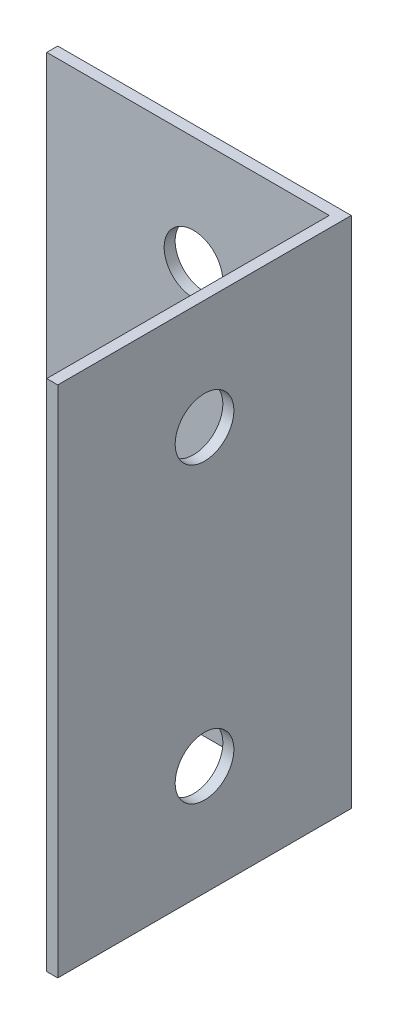
ISO-10303-21;
HEADER;
FILE_DESCRIPTION(('STEP AP214'),'2;1');
FILE_NAME('part.step','',(''),(''),'','','');
FILE_SCHEMA(('AUTOMOTIVE_DESIGN { 1 0 10303 214 1 1 1 1 }'));
ENDSEC;
DATA;
#1=APPLICATION_CONTEXT('core data for automotive mechanical design processes');
#2=APPLICATION_PROTOCOL_DEFINITION('international standard','automotive_design',2000,#1);
#3=PRODUCT_CONTEXT('',#1,'mechanical');
#4=PRODUCT('Part','Part','',(#3));
#5=PRODUCT_RELATED_PRODUCT_CATEGORY('part','',(#4));
#6=PRODUCT_DEFINITION_FORMATION('','',#4);
#7=PRODUCT_DEFINITION_CONTEXT('part definition',#1,'design');
#8=PRODUCT_DEFINITION('design','',#6,#7);
#9=PRODUCT_DEFINITION_SHAPE('','',#8);
#10=(LENGTH_UNIT() NAMED_UNIT(*) SI_UNIT(.MILLI.,.METRE.));
#11=(NAMED_UNIT(*) PLANE_ANGLE_UNIT() SI_UNIT($,.RADIAN.));
#12=(NAMED_UNIT(*) SI_UNIT($,.STERADIAN.) SOLID_ANGLE_UNIT());
#13=UNCERTAINTY_MEASURE_WITH_UNIT(LENGTH_MEASURE(1.E-05),#10,'distance_accuracy_value','');
#14=(GEOMETRIC_REPRESENTATION_CONTEXT(3) GLOBAL_UNCERTAINTY_ASSIGNED_CONTEXT((#13)) GLOBAL_UNIT_ASSIGNED_CONTEXT((#10,
#11,#12)) REPRESENTATION_CONTEXT('',''));
#15=CARTESIAN_POINT('',(0.,0.,0.));
#16=DIRECTION('',(0.,0.,1.));
#17=DIRECTION('',(1.,0.,0.));
#18=AXIS2_PLACEMENT_3D('',#15,#16,#17);
#19=CARTESIAN_POINT('',(-20.,-35.,40.));
#20=DIRECTION('',(1.,0.,0.));
#21=DIRECTION('',(0.,0.,-1.));
#22=AXIS2_PLACEMENT_3D('',#19,#20,#21);
#23=PLANE('',#22);
#24=DIRECTION('',(0.,0.,-1.));
#25=VECTOR('',#24,1.);
#26=CARTESIAN_POINT('',(-20.,-35.,40.));
#27=LINE('',#26,#25);
#28=CARTESIAN_POINT('',(-20.,-35.,1.5));
#29=VERTEX_POINT('',#28);
#30=CARTESIAN_POINT('',(-20.,-35.,0.));
#31=VERTEX_POINT('',#30);
#32=EDGE_CURVE('E47',#29,#31,#27,.T.);
#33=ORIENTED_EDGE('',*,*,#32,.F.);
#34=DIRECTION('',(0.,1.,0.));
#35=VECTOR('',#34,1.);
#36=CARTESIAN_POINT('',(-20.,-45.,1.5));
#37=LINE('',#36,#35);
#38=CARTESIAN_POINT('',(-20.,35.,1.5));
#39=VERTEX_POINT('',#38);
#40=EDGE_CURVE('E89',#29,#39,#37,.T.);
#41=ORIENTED_EDGE('',*,*,#40,.T.);
#42=DIRECTION('',(0.,0.,-1.));
#43=VECTOR('',#42,1.);
#44=CARTESIAN_POINT('',(-20.,35.,40.));
#45=LINE('',#44,#43);
#46=CARTESIAN_POINT('',(-20.,35.,0.));
#47=VERTEX_POINT('',#46);
#48=EDGE_CURVE('E82',#39,#47,#45,.T.);
#49=ORIENTED_EDGE('',*,*,#48,.T.);
#50=DIRECTION('',(0.,-1.,0.));
#51=VECTOR('',#50,1.);
#52=CARTESIAN_POINT('',(-20.,-35.,0.));
#53=LINE('',#52,#51);
#54=EDGE_CURVE('E86',#47,#31,#53,.T.);
#55=ORIENTED_EDGE('',*,*,#54,.T.);
#56=EDGE_LOOP('',(#33,#41,#49,#55));
#57=FACE_BOUND('',#56,.T.);
#58=ADVANCED_FACE('F39',(#57),#23,.F.);
#59=CARTESIAN_POINT('',(20.,-35.,40.));
#60=DIRECTION('',(0.,1.,0.));
#61=DIRECTION('',(-1.,0.,0.));
#62=AXIS2_PLACEMENT_3D('',#59,#60,#61);
#63=PLANE('',#62);
#64=DIRECTION('',(0.,0.,-1.));
#65=VECTOR('',#64,1.);
#66=CARTESIAN_POINT('',(18.5,-35.,40.));
#67=LINE('',#66,#65);
#68=CARTESIAN_POINT('',(18.5,-35.,40.));
#69=VERTEX_POINT('',#68);
#70=CARTESIAN_POINT('',(18.5,-35.,1.5));
#71=VERTEX_POINT('',#70);
#72=EDGE_CURVE('E53',#69,#71,#67,.T.);
#73=ORIENTED_EDGE('',*,*,#72,.T.);
#74=DIRECTION('',(-1.,0.,0.));
#75=VECTOR('',#74,1.);
#76=CARTESIAN_POINT('',(20.,-35.,1.5));
#77=LINE('',#76,#75);
#78=EDGE_CURVE('E111',#71,#29,#77,.T.);
#79=ORIENTED_EDGE('',*,*,#78,.T.);
#80=ORIENTED_EDGE('',*,*,#32,.T.);
#81=DIRECTION('',(1.,0.,0.));
#82=VECTOR('',#81,1.);
#83=CARTESIAN_POINT('',(20.,-35.,0.));
#84=LINE('',#83,#82);
#85=CARTESIAN_POINT('',(20.,-35.,0.));
#86=VERTEX_POINT('',#85);
#87=EDGE_CURVE('E109',#31,#86,#84,.T.);
#88=ORIENTED_EDGE('',*,*,#87,.T.);
#89=DIRECTION('',(0.,0.,-1.));
#90=VECTOR('',#89,1.);
#91=CARTESIAN_POINT('',(20.,-35.,40.));
#92=LINE('',#91,#90);
#93=CARTESIAN_POINT('',(20.,-35.,40.));
#94=VERTEX_POINT('',#93);
#95=EDGE_CURVE('E125',#94,#86,#92,.T.);
#96=ORIENTED_EDGE('',*,*,#95,.F.);
#97=DIRECTION('',(1.,0.,0.));
#98=VECTOR('',#97,1.);
#99=CARTESIAN_POINT('',(20.,-35.,40.));
#100=LINE('',#99,#98);
#101=EDGE_CURVE('E104',#69,#94,#100,.T.);
#102=ORIENTED_EDGE('',*,*,#101,.F.);
#103=EDGE_LOOP('',(#73,#79,#80,#88,#96,#102));
#104=FACE_BOUND('',#103,.T.);
#105=ADVANCED_FACE('F130',(#104),#63,.F.);
#106=CARTESIAN_POINT('',(20.,-35.,40.));
#107=DIRECTION('',(-1.,0.,0.));
#108=DIRECTION('',(0.,0.,1.));
#109=AXIS2_PLACEMENT_3D('',#106,#107,#108);
#110=PLANE('',#109);
#111=CARTESIAN_POINT('',(20.,20.,20.));
#112=DIRECTION('',(-1.,0.,0.));
#113=DIRECTION('',(0.,0.,1.));
#114=AXIS2_PLACEMENT_3D('',#111,#112,#113);
#115=CIRCLE('',#114,4.);
#116=CARTESIAN_POINT('',(20.,20.,24.));
#117=VERTEX_POINT('',#116);
#118=EDGE_CURVE('E150',#117,#117,#115,.T.);
#119=ORIENTED_EDGE('',*,*,#118,.T.);
#120=EDGE_LOOP('',(#119));
#121=FACE_BOUND('',#120,.T.);
#122=CARTESIAN_POINT('',(20.,-20.,20.));
#123=DIRECTION('',(-1.,0.,0.));
#124=DIRECTION('',(0.,0.,1.));
#125=AXIS2_PLACEMENT_3D('',#122,#123,#124);
#126=CIRCLE('',#125,4.);
#127=CARTESIAN_POINT('',(20.,-20.,24.));
#128=VERTEX_POINT('',#127);
#129=EDGE_CURVE('E170',#128,#128,#126,.T.);
#130=ORIENTED_EDGE('',*,*,#129,.T.);
#131=EDGE_LOOP('',(#130));
#132=FACE_BOUND('',#131,.T.);
#133=DIRECTION('',(0.,1.,0.));
#134=VECTOR('',#133,1.);
#135=CARTESIAN_POINT('',(20.,-35.,0.));
#136=LINE('',#135,#134);
#137=CARTESIAN_POINT('',(20.,35.,0.));
#138=VERTEX_POINT('',#137);
#139=EDGE_CURVE('E105',#86,#138,#136,.T.);
#140=ORIENTED_EDGE('',*,*,#139,.T.);
#141=DIRECTION('',(0.,0.,-1.));
#142=VECTOR('',#141,1.);
#143=CARTESIAN_POINT('',(20.,35.,40.));
#144=LINE('',#143,#142);
#145=CARTESIAN_POINT('',(20.,35.,40.));
#146=VERTEX_POINT('',#145);
#147=EDGE_CURVE('E93',#146,#138,#144,.T.);
#148=ORIENTED_EDGE('',*,*,#147,.F.);
#149=DIRECTION('',(0.,1.,0.));
#150=VECTOR('',#149,1.);
#151=CARTESIAN_POINT('',(20.,-35.,40.));
#152=LINE('',#151,#150);
#153=EDGE_CURVE('E62',#94,#146,#152,.T.);
#154=ORIENTED_EDGE('',*,*,#153,.F.);
#155=ORIENTED_EDGE('',*,*,#95,.T.);
#156=EDGE_LOOP('',(#140,#148,#154,#155));
#157=FACE_BOUND('',#156,.T.);
#158=ADVANCED_FACE('F208',(#121,#132,#157),#110,.F.);
#159=CARTESIAN_POINT('',(20.,35.,40.));
#160=DIRECTION('',(0.,-1.,0.));
#161=DIRECTION('',(0.,0.,-1.));
#162=AXIS2_PLACEMENT_3D('',#159,#160,#161);
#163=PLANE('',#162);
#164=ORIENTED_EDGE('',*,*,#48,.F.);
#165=DIRECTION('',(-1.,0.,0.));
#166=VECTOR('',#165,1.);
#167=CARTESIAN_POINT('',(-20.,35.,1.5));
#168=LINE('',#167,#166);
#169=CARTESIAN_POINT('',(18.5,35.,1.5));
#170=VERTEX_POINT('',#169);
#171=EDGE_CURVE('E148',#170,#39,#168,.T.);
#172=ORIENTED_EDGE('',*,*,#171,.F.);
#173=DIRECTION('',(0.,0.,-1.));
#174=VECTOR('',#173,1.);
#175=CARTESIAN_POINT('',(18.5,35.,40.));
#176=LINE('',#175,#174);
#177=CARTESIAN_POINT('',(18.5,35.,40.));
#178=VERTEX_POINT('',#177);
#179=EDGE_CURVE('E146',#178,#170,#176,.T.);
#180=ORIENTED_EDGE('',*,*,#179,.F.);
#181=DIRECTION('',(-1.,0.,0.));
#182=VECTOR('',#181,1.);
#183=CARTESIAN_POINT('',(20.,35.,40.));
#184=LINE('',#183,#182);
#185=EDGE_CURVE('E94',#146,#178,#184,.T.);
#186=ORIENTED_EDGE('',*,*,#185,.F.);
#187=ORIENTED_EDGE('',*,*,#147,.T.);
#188=DIRECTION('',(-1.,0.,0.));
#189=VECTOR('',#188,1.);
#190=CARTESIAN_POINT('',(20.,35.,0.));
#191=LINE('',#190,#189);
#192=EDGE_CURVE('E98',#138,#47,#191,.T.);
#193=ORIENTED_EDGE('',*,*,#192,.T.);
#194=EDGE_LOOP('',(#164,#172,#180,#186,#187,#193));
#195=FACE_BOUND('',#194,.T.);
#196=ADVANCED_FACE('F99',(#195),#163,.F.);
#197=CARTESIAN_POINT('',(0.,0.,40.));
#198=DIRECTION('',(0.,0.,1.));
#199=DIRECTION('',(1.,0.,0.));
#200=AXIS2_PLACEMENT_3D('',#197,#198,#199);
#201=PLANE('',#200);
#202=DIRECTION('',(0.,1.,0.));
#203=VECTOR('',#202,1.);
#204=CARTESIAN_POINT('',(18.5,0.,40.));
#205=LINE('',#204,#203);
#206=EDGE_CURVE('E11',#69,#178,#205,.T.);
#207=ORIENTED_EDGE('',*,*,#206,.F.);
#208=ORIENTED_EDGE('',*,*,#101,.T.);
#209=ORIENTED_EDGE('',*,*,#153,.T.);
#210=ORIENTED_EDGE('',*,*,#185,.T.);
#211=EDGE_LOOP('',(#207,#208,#209,#210));
#212=FACE_BOUND('',#211,.T.);
#213=ADVANCED_FACE('F152',(#212),#201,.T.);
#214=CARTESIAN_POINT('',(0.,0.,0.));
#215=DIRECTION('',(0.,0.,1.));
#216=DIRECTION('',(1.,0.,0.));
#217=AXIS2_PLACEMENT_3D('',#214,#215,#216);
#218=PLANE('',#217);
#219=CARTESIAN_POINT('',(0.,20.,0.));
#220=DIRECTION('',(0.,0.,1.));
#221=DIRECTION('',(1.,0.,0.));
#222=AXIS2_PLACEMENT_3D('',#219,#220,#221);
#223=CIRCLE('',#222,4.);
#224=CARTESIAN_POINT('',(4.,20.,0.));
#225=VERTEX_POINT('',#224);
#226=EDGE_CURVE('E179',#225,#225,#223,.T.);
#227=ORIENTED_EDGE('',*,*,#226,.T.);
#228=EDGE_LOOP('',(#227));
#229=FACE_BOUND('',#228,.T.);
#230=CARTESIAN_POINT('',(0.,-20.,0.));
#231=DIRECTION('',(0.,0.,1.));
#232=DIRECTION('',(1.,0.,0.));
#233=AXIS2_PLACEMENT_3D('',#230,#231,#232);
#234=CIRCLE('',#233,4.);
#235=CARTESIAN_POINT('',(4.,-20.,0.));
#236=VERTEX_POINT('',#235);
#237=EDGE_CURVE('E186',#236,#236,#234,.T.);
#238=ORIENTED_EDGE('',*,*,#237,.T.);
#239=EDGE_LOOP('',(#238));
#240=FACE_BOUND('',#239,.T.);
#241=ORIENTED_EDGE('',*,*,#54,.F.);
#242=ORIENTED_EDGE('',*,*,#192,.F.);
#243=ORIENTED_EDGE('',*,*,#139,.F.);
#244=ORIENTED_EDGE('',*,*,#87,.F.);
#245=EDGE_LOOP('',(#241,#242,#243,#244));
#246=FACE_BOUND('',#245,.T.);
#247=ADVANCED_FACE('F108',(#229,#240,#246),#218,.F.);
#248=CARTESIAN_POINT('',(-20.,-45.,1.5));
#249=DIRECTION('',(0.,0.,-1.));
#250=DIRECTION('',(-1.,0.,0.));
#251=AXIS2_PLACEMENT_3D('',#248,#249,#250);
#252=PLANE('',#251);
#253=CARTESIAN_POINT('',(0.,20.,1.5));
#254=DIRECTION('',(0.,0.,1.));
#255=DIRECTION('',(1.,0.,0.));
#256=AXIS2_PLACEMENT_3D('',#253,#254,#255);
#257=CIRCLE('',#256,4.);
#258=CARTESIAN_POINT('',(4.,20.,1.5));
#259=VERTEX_POINT('',#258);
#260=EDGE_CURVE('E190',#259,#259,#257,.T.);
#261=ORIENTED_EDGE('',*,*,#260,.F.);
#262=EDGE_LOOP('',(#261));
#263=FACE_BOUND('',#262,.T.);
#264=CARTESIAN_POINT('',(0.,-20.,1.5));
#265=DIRECTION('',(0.,0.,1.));
#266=DIRECTION('',(-1.,0.,0.));
#267=AXIS2_PLACEMENT_3D('',#264,#265,#266);
#268=CIRCLE('',#267,4.);
#269=CARTESIAN_POINT('',(4.,-20.,1.5));
#270=VERTEX_POINT('',#269);
#271=EDGE_CURVE('E191',#270,#270,#268,.T.);
#272=ORIENTED_EDGE('',*,*,#271,.F.);
#273=EDGE_LOOP('',(#272));
#274=FACE_BOUND('',#273,.T.);
#275=DIRECTION('',(0.,1.,0.));
#276=VECTOR('',#275,1.);
#277=CARTESIAN_POINT('',(18.5,-45.,1.5));
#278=LINE('',#277,#276);
#279=EDGE_CURVE('E160',#71,#170,#278,.T.);
#280=ORIENTED_EDGE('',*,*,#279,.T.);
#281=ORIENTED_EDGE('',*,*,#171,.T.);
#282=ORIENTED_EDGE('',*,*,#40,.F.);
#283=ORIENTED_EDGE('',*,*,#78,.F.);
#284=EDGE_LOOP('',(#280,#281,#282,#283));
#285=FACE_BOUND('',#284,.T.);
#286=ADVANCED_FACE('F202',(#263,#274,#285),#252,.F.);
#287=CARTESIAN_POINT('',(18.5,-45.,40.));
#288=DIRECTION('',(1.,0.,0.));
#289=DIRECTION('',(0.,1.,0.));
#290=AXIS2_PLACEMENT_3D('',#287,#288,#289);
#291=PLANE('',#290);
#292=CARTESIAN_POINT('',(18.5,20.,20.));
#293=DIRECTION('',(-1.,0.,0.));
#294=DIRECTION('',(0.,-1.,0.));
#295=AXIS2_PLACEMENT_3D('',#292,#293,#294);
#296=CIRCLE('',#295,4.);
#297=CARTESIAN_POINT('',(18.5,16.,20.));
#298=VERTEX_POINT('',#297);
#299=EDGE_CURVE('E174',#298,#298,#296,.T.);
#300=ORIENTED_EDGE('',*,*,#299,.F.);
#301=EDGE_LOOP('',(#300));
#302=FACE_BOUND('',#301,.T.);
#303=CARTESIAN_POINT('',(18.5,-20.,20.));
#304=DIRECTION('',(-1.,0.,0.));
#305=DIRECTION('',(0.,1.,0.));
#306=AXIS2_PLACEMENT_3D('',#303,#304,#305);
#307=CIRCLE('',#306,4.);
#308=CARTESIAN_POINT('',(18.5,-16.,20.));
#309=VERTEX_POINT('',#308);
#310=EDGE_CURVE('E175',#309,#309,#307,.T.);
#311=ORIENTED_EDGE('',*,*,#310,.F.);
#312=EDGE_LOOP('',(#311));
#313=FACE_BOUND('',#312,.T.);
#314=ORIENTED_EDGE('',*,*,#206,.T.);
#315=ORIENTED_EDGE('',*,*,#179,.T.);
#316=ORIENTED_EDGE('',*,*,#279,.F.);
#317=ORIENTED_EDGE('',*,*,#72,.F.);
#318=EDGE_LOOP('',(#314,#315,#316,#317));
#319=FACE_BOUND('',#318,.T.);
#320=ADVANCED_FACE('F145',(#302,#313,#319),#291,.F.);
#321=CARTESIAN_POINT('',(98.5000000000001,-20.,20.));
#322=DIRECTION('',(-1.,0.,0.));
#323=DIRECTION('',(0.,-1.,0.));
#324=AXIS2_PLACEMENT_3D('',#321,#322,#323);
#325=CYLINDRICAL_SURFACE('',#324,4.);
#326=ORIENTED_EDGE('',*,*,#310,.T.);
#327=EDGE_LOOP('',(#326));
#328=FACE_BOUND('',#327,.T.);
#329=ORIENTED_EDGE('',*,*,#129,.F.);
#330=EDGE_LOOP('',(#329));
#331=FACE_BOUND('',#330,.T.);
#332=ADVANCED_FACE('F254',(#328,#331),#325,.F.);
#333=CARTESIAN_POINT('',(98.5,20.,20.));
#334=DIRECTION('',(-1.,0.,0.));
#335=DIRECTION('',(0.,-1.,0.));
#336=AXIS2_PLACEMENT_3D('',#333,#334,#335);
#337=CYLINDRICAL_SURFACE('',#336,4.);
#338=ORIENTED_EDGE('',*,*,#299,.T.);
#339=EDGE_LOOP('',(#338));
#340=FACE_BOUND('',#339,.T.);
#341=ORIENTED_EDGE('',*,*,#118,.F.);
#342=EDGE_LOOP('',(#341));
#343=FACE_BOUND('',#342,.T.);
#344=ADVANCED_FACE('F265',(#340,#343),#337,.F.);
#345=CARTESIAN_POINT('',(0.,-20.,-38.5));
#346=DIRECTION('',(0.,0.,1.));
#347=DIRECTION('',(1.,0.,0.));
#348=AXIS2_PLACEMENT_3D('',#345,#346,#347);
#349=CYLINDRICAL_SURFACE('',#348,4.);
#350=CARTESIAN_POINT('',(4.,-20.,1.5));
#351=CARTESIAN_POINT('',(4.,-20.,1.484375));
#352=CARTESIAN_POINT('',(4.,-20.,1.46875));
#353=CARTESIAN_POINT('',(4.,-20.,1.4375));
#354=CARTESIAN_POINT('',(4.,-20.,1.421875));
#355=CARTESIAN_POINT('',(4.,-20.,1.390625));
#356=CARTESIAN_POINT('',(4.,-20.,1.375));
#357=CARTESIAN_POINT('',(4.,-20.,1.34375));
#358=CARTESIAN_POINT('',(4.,-20.,1.328125));
#359=CARTESIAN_POINT('',(4.,-20.,1.296875));
#360=CARTESIAN_POINT('',(4.,-20.,1.28125));
#361=CARTESIAN_POINT('',(4.,-20.,1.25));
#362=CARTESIAN_POINT('',(4.,-20.,1.234375));
#363=CARTESIAN_POINT('',(4.,-20.,1.203125));
#364=CARTESIAN_POINT('',(4.,-20.,1.1875));
#365=CARTESIAN_POINT('',(4.,-20.,1.15625));
#366=CARTESIAN_POINT('',(4.,-20.,1.140625));
#367=CARTESIAN_POINT('',(4.,-20.,1.109375));
#368=CARTESIAN_POINT('',(4.,-20.,1.09375));
#369=CARTESIAN_POINT('',(4.,-20.,1.0625));
#370=CARTESIAN_POINT('',(4.,-20.,1.046875));
#371=CARTESIAN_POINT('',(4.,-20.,1.015625));
#372=CARTESIAN_POINT('',(4.,-20.,1.));
#373=CARTESIAN_POINT('',(4.,-20.,0.968750000000002));
#374=CARTESIAN_POINT('',(4.,-20.,0.953125000000001));
#375=CARTESIAN_POINT('',(4.,-20.,0.921875));
#376=CARTESIAN_POINT('',(4.,-20.,0.90625));
#377=CARTESIAN_POINT('',(4.,-20.,0.875000000000001));
#378=CARTESIAN_POINT('',(4.,-20.,0.859375000000002));
#379=CARTESIAN_POINT('',(4.,-20.,0.828125000000004));
#380=CARTESIAN_POINT('',(4.,-20.,0.812500000000003));
#381=CARTESIAN_POINT('',(4.,-20.,0.781250000000002));
#382=CARTESIAN_POINT('',(4.,-20.,0.765625000000001));
#383=CARTESIAN_POINT('',(4.,-20.,0.734375));
#384=CARTESIAN_POINT('',(4.,-20.,0.718749999999999));
#385=CARTESIAN_POINT('',(4.,-20.,0.687499999999998));
#386=CARTESIAN_POINT('',(4.,-20.,0.671874999999998));
#387=CARTESIAN_POINT('',(4.,-20.,0.640624999999999));
#388=CARTESIAN_POINT('',(4.,-20.,0.625000000000001));
#389=CARTESIAN_POINT('',(4.,-20.,0.593750000000002));
#390=CARTESIAN_POINT('',(4.,-20.,0.578125000000001));
#391=CARTESIAN_POINT('',(4.,-20.,0.546875));
#392=CARTESIAN_POINT('',(4.,-20.,0.531249999999999));
#393=CARTESIAN_POINT('',(4.,-20.,0.5));
#394=CARTESIAN_POINT('',(4.,-20.,0.484375000000002));
#395=CARTESIAN_POINT('',(4.,-20.,0.453125000000003));
#396=CARTESIAN_POINT('',(4.,-20.,0.437500000000003));
#397=CARTESIAN_POINT('',(4.,-20.,0.406250000000001));
#398=CARTESIAN_POINT('',(4.,-20.,0.390625000000001));
#399=CARTESIAN_POINT('',(4.,-20.,0.359375));
#400=CARTESIAN_POINT('',(4.,-20.,0.343749999999999));
#401=CARTESIAN_POINT('',(4.,-20.,0.312499999999998));
#402=CARTESIAN_POINT('',(4.,-20.,0.296874999999997));
#403=CARTESIAN_POINT('',(4.,-20.,0.265624999999999));
#404=CARTESIAN_POINT('',(4.,-20.,0.25));
#405=CARTESIAN_POINT('',(4.,-20.,0.218750000000001));
#406=CARTESIAN_POINT('',(4.,-20.,0.203125000000001));
#407=CARTESIAN_POINT('',(4.,-20.,0.171875));
#408=CARTESIAN_POINT('',(4.,-20.,0.156249999999999));
#409=CARTESIAN_POINT('',(4.,-20.,0.125));
#410=CARTESIAN_POINT('',(4.,-20.,0.109375000000002));
#411=CARTESIAN_POINT('',(4.,-20.,0.078125000000003));
#412=CARTESIAN_POINT('',(4.,-20.,0.0625000000000024));
#413=CARTESIAN_POINT('',(4.,-20.,0.0312500000000012));
#414=CARTESIAN_POINT('',(4.,-20.,0.0156250000000006));
#415=CARTESIAN_POINT('',(4.,-20.,0.));
#416=B_SPLINE_CURVE_WITH_KNOTS('',3,(#350,#351,#352,#353,#354,#355,#356,#357,#358,#359,#360,
#361,#362,#363,#364,#365,#366,#367,#368,#369,#370,#371,#372,#373,#374,#375,#376,#377,#378,#379,
#380,#381,#382,#383,#384,#385,#386,#387,#388,#389,#390,#391,#392,#393,#394,#395,#396,#397,#398,
#399,#400,#401,#402,#403,#404,#405,#406,#407,#408,#409,#410,#411,#412,#413,#414,#415),
.UNSPECIFIED.,.F.,.F.,(4,2,2,2,2,2,2,2,2,2,2,2,2,2,2,2,2,2,2,2,2,2,2,2,2,2,2,2,2,2,2,2,4),(0.,
0.0468750000000018,0.0937500000000036,0.140624999999998,0.1875,0.234375000000002,
0.281249999999997,0.328124999999999,0.375,0.421875000000002,0.468750000000004,0.515624999999999,
0.5625,0.609375000000002,0.656249999999997,0.703124999999999,0.750000000000001,
0.796875000000002,0.843750000000004,0.890624999999999,0.937500000000001,0.984375000000003,
1.03125,1.078125,1.125,1.171875,1.21875,1.265625,1.3125,1.359375,1.40625,1.453125,1.5),.UNSPECIFIED.);
#417=EDGE_CURVE('BSEAM275',#270,#236,#416,.T.);
#418=ORIENTED_EDGE('',*,*,#271,.T.);
#419=ORIENTED_EDGE('',*,*,#237,.F.);
#420=ORIENTED_EDGE('',*,*,#417,.T.);
#421=ORIENTED_EDGE('',*,*,#417,.F.);
#422=EDGE_LOOP('',(#418,#420,#419,#421));
#423=FACE_BOUND('',#422,.T.);
#424=ADVANCED_FACE('F275',(#423),#349,.F.);
#425=CARTESIAN_POINT('',(0.,20.,-38.5));
#426=DIRECTION('',(0.,0.,1.));
#427=DIRECTION('',(1.,0.,0.));
#428=AXIS2_PLACEMENT_3D('',#425,#426,#427);
#429=CYLINDRICAL_SURFACE('',#428,4.);
#430=CARTESIAN_POINT('',(4.,20.,1.5));
#431=CARTESIAN_POINT('',(4.,20.,1.484375));
#432=CARTESIAN_POINT('',(4.,20.,1.46875));
#433=CARTESIAN_POINT('',(4.,20.,1.4375));
#434=CARTESIAN_POINT('',(4.,20.,1.421875));
#435=CARTESIAN_POINT('',(4.,20.,1.390625));
#436=CARTESIAN_POINT('',(4.,20.,1.375));
#437=CARTESIAN_POINT('',(4.,20.,1.34375));
#438=CARTESIAN_POINT('',(4.,20.,1.328125));
#439=CARTESIAN_POINT('',(4.,20.,1.296875));
#440=CARTESIAN_POINT('',(4.,20.,1.28125));
#441=CARTESIAN_POINT('',(4.,20.,1.25));
#442=CARTESIAN_POINT('',(4.,20.,1.234375));
#443=CARTESIAN_POINT('',(4.,20.,1.203125));
#444=CARTESIAN_POINT('',(4.,20.,1.1875));
#445=CARTESIAN_POINT('',(4.,20.,1.15625));
#446=CARTESIAN_POINT('',(4.,20.,1.140625));
#447=CARTESIAN_POINT('',(4.,20.,1.109375));
#448=CARTESIAN_POINT('',(4.,20.,1.09375));
#449=CARTESIAN_POINT('',(4.,20.,1.0625));
#450=CARTESIAN_POINT('',(4.,20.,1.046875));
#451=CARTESIAN_POINT('',(4.,20.,1.015625));
#452=CARTESIAN_POINT('',(4.,20.,1.));
#453=CARTESIAN_POINT('',(4.,20.,0.968750000000002));
#454=CARTESIAN_POINT('',(4.,20.,0.953125000000001));
#455=CARTESIAN_POINT('',(4.,20.,0.921875));
#456=CARTESIAN_POINT('',(4.,20.,0.90625));
#457=CARTESIAN_POINT('',(4.,20.,0.875000000000001));
#458=CARTESIAN_POINT('',(4.,20.,0.859375000000002));
#459=CARTESIAN_POINT('',(4.,20.,0.828125000000004));
#460=CARTESIAN_POINT('',(4.,20.,0.812500000000003));
#461=CARTESIAN_POINT('',(4.,20.,0.781250000000002));
#462=CARTESIAN_POINT('',(4.,20.,0.765625000000001));
#463=CARTESIAN_POINT('',(4.,20.,0.734375));
#464=CARTESIAN_POINT('',(4.,20.,0.718749999999999));
#465=CARTESIAN_POINT('',(4.,20.,0.687499999999998));
#466=CARTESIAN_POINT('',(4.,20.,0.671874999999998));
#467=CARTESIAN_POINT('',(4.,20.,0.640624999999999));
#468=CARTESIAN_POINT('',(4.,20.,0.625000000000001));
#469=CARTESIAN_POINT('',(4.,20.,0.593750000000002));
#470=CARTESIAN_POINT('',(4.,20.,0.578125000000001));
#471=CARTESIAN_POINT('',(4.,20.,0.546875));
#472=CARTESIAN_POINT('',(4.,20.,0.531249999999999));
#473=CARTESIAN_POINT('',(4.,20.,0.5));
#474=CARTESIAN_POINT('',(4.,20.,0.484375000000002));
#475=CARTESIAN_POINT('',(4.,20.,0.453125000000003));
#476=CARTESIAN_POINT('',(4.,20.,0.437500000000003));
#477=CARTESIAN_POINT('',(4.,20.,0.406250000000001));
#478=CARTESIAN_POINT('',(4.,20.,0.390625000000001));
#479=CARTESIAN_POINT('',(4.,20.,0.359375));
#480=CARTESIAN_POINT('',(4.,20.,0.343749999999999));
#481=CARTESIAN_POINT('',(4.,20.,0.312499999999998));
#482=CARTESIAN_POINT('',(4.,20.,0.296874999999997));
#483=CARTESIAN_POINT('',(4.,20.,0.265624999999999));
#484=CARTESIAN_POINT('',(4.,20.,0.25));
#485=CARTESIAN_POINT('',(4.,20.,0.218750000000001));
#486=CARTESIAN_POINT('',(4.,20.,0.203125000000001));
#487=CARTESIAN_POINT('',(4.,20.,0.171875));
#488=CARTESIAN_POINT('',(4.,20.,0.156249999999999));
#489=CARTESIAN_POINT('',(4.,20.,0.125));
#490=CARTESIAN_POINT('',(4.,20.,0.109375000000002));
#491=CARTESIAN_POINT('',(4.,20.,0.078125000000003));
#492=CARTESIAN_POINT('',(4.,20.,0.0625000000000024));
#493=CARTESIAN_POINT('',(4.,20.,0.0312500000000012));
#494=CARTESIAN_POINT('',(4.,20.,0.0156250000000006));
#495=CARTESIAN_POINT('',(4.,20.,0.));
#496=B_SPLINE_CURVE_WITH_KNOTS('',3,(#430,#431,#432,#433,#434,#435,#436,#437,#438,#439,#440,
#441,#442,#443,#444,#445,#446,#447,#448,#449,#450,#451,#452,#453,#454,#455,#456,#457,#458,#459,
#460,#461,#462,#463,#464,#465,#466,#467,#468,#469,#470,#471,#472,#473,#474,#475,#476,#477,#478,
#479,#480,#481,#482,#483,#484,#485,#486,#487,#488,#489,#490,#491,#492,#493,#494,#495),
.UNSPECIFIED.,.F.,.F.,(4,2,2,2,2,2,2,2,2,2,2,2,2,2,2,2,2,2,2,2,2,2,2,2,2,2,2,2,2,2,2,2,4),(0.,
0.0468750000000018,0.0937500000000036,0.140624999999998,0.1875,0.234375000000002,
0.281249999999997,0.328124999999999,0.375,0.421875000000002,0.468750000000004,0.515624999999999,
0.5625,0.609375000000002,0.656249999999997,0.703124999999999,0.750000000000001,
0.796875000000002,0.843750000000004,0.890624999999999,0.937500000000001,0.984375000000003,
1.03125,1.078125,1.125,1.171875,1.21875,1.265625,1.3125,1.359375,1.40625,1.453125,1.5),.UNSPECIFIED.);
#497=EDGE_CURVE('BSEAM199',#259,#225,#496,.T.);
#498=ORIENTED_EDGE('',*,*,#260,.T.);
#499=ORIENTED_EDGE('',*,*,#226,.F.);
#500=ORIENTED_EDGE('',*,*,#497,.T.);
#501=ORIENTED_EDGE('',*,*,#497,.F.);
#502=EDGE_LOOP('',(#498,#500,#499,#501));
#503=FACE_BOUND('',#502,.T.);
#504=ADVANCED_FACE('F199',(#503),#429,.F.);
#505=CLOSED_SHELL('',(#58,#105,#158,#196,#213,#247,#286,#320,#332,#344,#424,#504));
#506=MANIFOLD_SOLID_BREP('B2',#505);
#507=ADVANCED_BREP_SHAPE_REPRESENTATION('',(#18,#506),#14);
#508=SHAPE_DEFINITION_REPRESENTATION(#9,#507);
ENDSEC;
END-ISO-10303-21;
